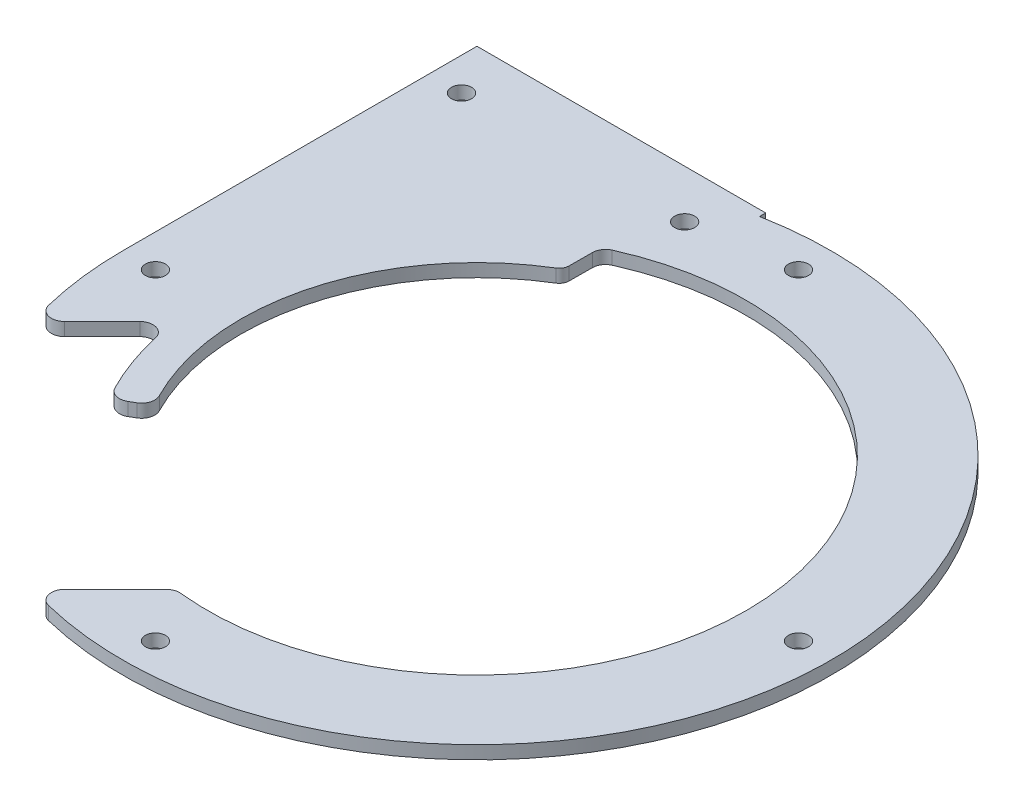
ISO-10303-21;
HEADER;
FILE_DESCRIPTION(('STEP AP214'),'2;1');
FILE_NAME('part.step','',(''),(''),'','','');
FILE_SCHEMA(('AUTOMOTIVE_DESIGN { 1 0 10303 214 1 1 1 1 }'));
ENDSEC;
DATA;
#1=APPLICATION_CONTEXT('core data for automotive mechanical design processes');
#2=APPLICATION_PROTOCOL_DEFINITION('international standard','automotive_design',2000,#1);
#3=PRODUCT_CONTEXT('',#1,'mechanical');
#4=PRODUCT('Part','Part','',(#3));
#5=PRODUCT_RELATED_PRODUCT_CATEGORY('part','',(#4));
#6=PRODUCT_DEFINITION_FORMATION('','',#4);
#7=PRODUCT_DEFINITION_CONTEXT('part definition',#1,'design');
#8=PRODUCT_DEFINITION('design','',#6,#7);
#9=PRODUCT_DEFINITION_SHAPE('','',#8);
#10=(LENGTH_UNIT() NAMED_UNIT(*) SI_UNIT(.MILLI.,.METRE.));
#11=(NAMED_UNIT(*) PLANE_ANGLE_UNIT() SI_UNIT($,.RADIAN.));
#12=(NAMED_UNIT(*) SI_UNIT($,.STERADIAN.) SOLID_ANGLE_UNIT());
#13=UNCERTAINTY_MEASURE_WITH_UNIT(LENGTH_MEASURE(1.E-05),#10,'distance_accuracy_value','');
#14=(GEOMETRIC_REPRESENTATION_CONTEXT(3) GLOBAL_UNCERTAINTY_ASSIGNED_CONTEXT((#13)) GLOBAL_UNIT_ASSIGNED_CONTEXT((#10,
#11,#12)) REPRESENTATION_CONTEXT('',''));
#15=CARTESIAN_POINT('',(0.,0.,0.));
#16=DIRECTION('',(0.,0.,1.));
#17=DIRECTION('',(1.,0.,0.));
#18=AXIS2_PLACEMENT_3D('',#15,#16,#17);
#19=CARTESIAN_POINT('',(0.,0.,0.));
#20=DIRECTION('',(0.,1.,0.));
#21=DIRECTION('',(0.,0.,1.));
#22=AXIS2_PLACEMENT_3D('',#19,#20,#21);
#23=PLANE('',#22);
#24=CARTESIAN_POINT('',(-49.,0.,-46.6476151587624));
#25=DIRECTION('',(0.,1.,0.));
#26=DIRECTION('',(0.,0.,1.));
#27=AXIS2_PLACEMENT_3D('',#24,#25,#26);
#28=CIRCLE('',#27,1.525);
#29=CARTESIAN_POINT('',(-49.,0.,-45.1226151587624));
#30=VERTEX_POINT('',#29);
#31=EDGE_CURVE('E194',#30,#30,#28,.T.);
#32=ORIENTED_EDGE('',*,*,#31,.T.);
#33=EDGE_LOOP('',(#32));
#34=FACE_BOUND('',#33,.T.);
#35=CARTESIAN_POINT('',(-49.,0.,0.));
#36=DIRECTION('',(0.,1.,0.));
#37=DIRECTION('',(0.,0.,1.));
#38=AXIS2_PLACEMENT_3D('',#35,#36,#37);
#39=CIRCLE('',#38,1.525);
#40=CARTESIAN_POINT('',(-49.,0.,1.525));
#41=VERTEX_POINT('',#40);
#42=EDGE_CURVE('E227',#41,#41,#39,.T.);
#43=ORIENTED_EDGE('',*,*,#42,.T.);
#44=EDGE_LOOP('',(#43));
#45=FACE_BOUND('',#44,.T.);
#46=CARTESIAN_POINT('',(0.,0.,49.));
#47=DIRECTION('',(0.,1.,0.));
#48=DIRECTION('',(0.,0.,1.));
#49=AXIS2_PLACEMENT_3D('',#46,#47,#48);
#50=CIRCLE('',#49,1.525);
#51=CARTESIAN_POINT('',(0.,0.,50.525));
#52=VERTEX_POINT('',#51);
#53=EDGE_CURVE('E232',#52,#52,#50,.T.);
#54=ORIENTED_EDGE('',*,*,#53,.T.);
#55=EDGE_LOOP('',(#54));
#56=FACE_BOUND('',#55,.T.);
#57=CARTESIAN_POINT('',(49.,0.,0.));
#58=DIRECTION('',(0.,1.,0.));
#59=DIRECTION('',(0.,0.,1.));
#60=AXIS2_PLACEMENT_3D('',#57,#58,#59);
#61=CIRCLE('',#60,1.525);
#62=CARTESIAN_POINT('',(49.,0.,1.52499999999999));
#63=VERTEX_POINT('',#62);
#64=EDGE_CURVE('E243',#63,#63,#61,.T.);
#65=ORIENTED_EDGE('',*,*,#64,.T.);
#66=EDGE_LOOP('',(#65));
#67=FACE_BOUND('',#66,.T.);
#68=CARTESIAN_POINT('',(0.,0.,-49.));
#69=DIRECTION('',(0.,1.,0.));
#70=DIRECTION('',(0.,0.,1.));
#71=AXIS2_PLACEMENT_3D('',#68,#69,#70);
#72=CIRCLE('',#71,1.525);
#73=CARTESIAN_POINT('',(0.,0.,-47.475));
#74=VERTEX_POINT('',#73);
#75=EDGE_CURVE('E252',#74,#74,#72,.T.);
#76=ORIENTED_EDGE('',*,*,#75,.T.);
#77=EDGE_LOOP('',(#76));
#78=FACE_BOUND('',#77,.T.);
#79=CARTESIAN_POINT('',(-15.,0.,-46.6476151587624));
#80=DIRECTION('',(0.,1.,0.));
#81=DIRECTION('',(0.,0.,1.));
#82=AXIS2_PLACEMENT_3D('',#79,#80,#81);
#83=CIRCLE('',#82,1.525);
#84=CARTESIAN_POINT('',(-15.,0.,-45.1226151587624));
#85=VERTEX_POINT('',#84);
#86=EDGE_CURVE('E259',#85,#85,#83,.T.);
#87=ORIENTED_EDGE('',*,*,#86,.T.);
#88=EDGE_LOOP('',(#87));
#89=FACE_BOUND('',#88,.T.);
#90=DIRECTION('',(-0.707106781186546,0.,0.707106781186549));
#91=VECTOR('',#90,1.);
#92=CARTESIAN_POINT('',(-16.1675664718771,0.,51.5229055312046));
#93=LINE('',#92,#91);
#94=CARTESIAN_POINT('',(-5.98664960273474,0.,41.3419886620622));
#95=VERTEX_POINT('',#94);
#96=CARTESIAN_POINT('',(-13.7468431952776,0.,49.102182254605));
#97=VERTEX_POINT('',#96);
#98=EDGE_CURVE('E436',#95,#97,#93,.T.);
#99=ORIENTED_EDGE('',*,*,#98,.F.);
#100=CARTESIAN_POINT('',(-4.57243604036164,0.,42.7562022244353));
#101=DIRECTION('',(0.,1.,0.));
#102=DIRECTION('',(0.,0.,1.));
#103=AXIS2_PLACEMENT_3D('',#100,#101,#102);
#104=CIRCLE('',#103,2.);
#105=CARTESIAN_POINT('',(-4.35976459662389,0.,40.7675416558569));
#106=VERTEX_POINT('',#105);
#107=EDGE_CURVE('E360',#95,#106,#104,.F.);
#108=ORIENTED_EDGE('',*,*,#107,.T.);
#109=CARTESIAN_POINT('',(0.,0.,0.));
#110=DIRECTION('',(0.,1.,0.));
#111=DIRECTION('',(0.,0.,1.));
#112=AXIS2_PLACEMENT_3D('',#109,#110,#111);
#113=CIRCLE('',#112,41.);
#114=CARTESIAN_POINT('',(-16.7986572287805,0.,-37.4006031409915));
#115=VERTEX_POINT('',#114);
#116=EDGE_CURVE('E266',#106,#115,#113,.T.);
#117=ORIENTED_EDGE('',*,*,#116,.T.);
#118=CARTESIAN_POINT('',(-15.9792105346936,0.,-35.5761834755773));
#119=DIRECTION('',(0.,1.,0.));
#120=DIRECTION('',(0.,0.,1.));
#121=AXIS2_PLACEMENT_3D('',#118,#119,#120);
#122=CIRCLE('',#121,2.);
#123=CARTESIAN_POINT('',(-17.9791882510179,0.,-35.5856245669424));
#124=VERTEX_POINT('',#123);
#125=EDGE_CURVE('E327',#115,#124,#122,.T.);
#126=ORIENTED_EDGE('',*,*,#125,.T.);
#127=DIRECTION('',(0.00472054568255677,0.,-0.999988858162159));
#128=VECTOR('',#127,1.);
#129=CARTESIAN_POINT('',(-17.9959889497554,0.,-32.0266056152006));
#130=LINE('',#129,#128);
#131=CARTESIAN_POINT('',(-17.9959889497554,0.,-32.0266056152006));
#132=VERTEX_POINT('',#131);
#133=EDGE_CURVE('E202',#132,#124,#130,.T.);
#134=ORIENTED_EDGE('',*,*,#133,.F.);
#135=CARTESIAN_POINT('',(-19.4959722369986,0.,-32.0336864337244));
#136=DIRECTION('',(0.,1.,0.));
#137=DIRECTION('',(0.,0.,1.));
#138=AXIS2_PLACEMENT_3D('',#135,#136,#137);
#139=CIRCLE('',#138,1.5);
#140=CARTESIAN_POINT('',(-18.7161333475187,0.,-30.7523389763754));
#141=VERTEX_POINT('',#140);
#142=EDGE_CURVE('E205',#141,#132,#139,.T.);
#143=ORIENTED_EDGE('',*,*,#142,.F.);
#144=CARTESIAN_POINT('',(0.,0.,0.));
#145=DIRECTION('',(0.,-1.,0.));
#146=DIRECTION('',(0.,0.,1.));
#147=AXIS2_PLACEMENT_3D('',#144,#145,#146);
#148=CIRCLE('',#147,36.);
#149=CARTESIAN_POINT('',(-32.0810716897673,0.,16.3341617243129));
#150=VERTEX_POINT('',#149);
#151=EDGE_CURVE('E212',#150,#141,#148,.T.);
#152=ORIENTED_EDGE('',*,*,#151,.F.);
#153=CARTESIAN_POINT('',(-33.86335345031,0.,17.2416151534414));
#154=DIRECTION('',(0.,1.,0.));
#155=DIRECTION('',(0.,0.,1.));
#156=AXIS2_PLACEMENT_3D('',#153,#154,#155);
#157=CIRCLE('',#156,2.);
#158=CARTESIAN_POINT('',(-32.86335345031,0.,18.9736659610103));
#159=VERTEX_POINT('',#158);
#160=EDGE_CURVE('E350',#150,#159,#157,.F.);
#161=ORIENTED_EDGE('',*,*,#160,.T.);
#162=DIRECTION('',(-0.866025403784438,0.,0.5));
#163=VECTOR('',#162,1.);
#164=CARTESIAN_POINT('',(-31.1769145362398,0.,18.));
#165=LINE('',#164,#163);
#166=CARTESIAN_POINT('',(-33.7305499510459,0.,19.4743420941505));
#167=VERTEX_POINT('',#166);
#168=EDGE_CURVE('E434',#159,#167,#165,.T.);
#169=ORIENTED_EDGE('',*,*,#168,.T.);
#170=CARTESIAN_POINT('',(-34.7305499510459,0.,17.7422912865816));
#171=DIRECTION('',(0.,1.,0.));
#172=DIRECTION('',(0.,0.,1.));
#173=AXIS2_PLACEMENT_3D('',#170,#171,#172);
#174=CIRCLE('',#173,2.);
#175=CARTESIAN_POINT('',(-36.5116037946892,0.,18.6521523782012));
#176=VERTEX_POINT('',#175);
#177=EDGE_CURVE('E358',#167,#176,#174,.F.);
#178=ORIENTED_EDGE('',*,*,#177,.T.);
#179=CARTESIAN_POINT('',(0.,0.,0.));
#180=DIRECTION('',(0.,1.,0.));
#181=DIRECTION('',(0.,0.,1.));
#182=AXIS2_PLACEMENT_3D('',#179,#180,#181);
#183=CIRCLE('',#182,41.);
#184=CARTESIAN_POINT('',(-40.0025759560338,0.,8.98854364631698));
#185=VERTEX_POINT('',#184);
#186=EDGE_CURVE('E416',#185,#176,#183,.T.);
#187=ORIENTED_EDGE('',*,*,#186,.F.);
#188=CARTESIAN_POINT('',(-41.9539211246208,0.,9.42700919003975));
#189=DIRECTION('',(0.,1.,0.));
#190=DIRECTION('',(0.,0.,1.));
#191=AXIS2_PLACEMENT_3D('',#188,#189,#190);
#192=CIRCLE('',#191,2.);
#193=CARTESIAN_POINT('',(-43.3681346869939,0.,8.01279562766666));
#194=VERTEX_POINT('',#193);
#195=EDGE_CURVE('E53',#185,#194,#192,.T.);
#196=ORIENTED_EDGE('',*,*,#195,.T.);
#197=DIRECTION('',(0.707106781186547,0.,-0.707106781186548));
#198=VECTOR('',#197,1.);
#199=CARTESIAN_POINT('',(-51.5229055312045,0.,16.1675664718773));
#200=LINE('',#199,#198);
#201=CARTESIAN_POINT('',(-49.102182254605,0.,13.7468431952777));
#202=VERTEX_POINT('',#201);
#203=EDGE_CURVE('E411',#202,#194,#200,.T.);
#204=ORIENTED_EDGE('',*,*,#203,.F.);
#205=CARTESIAN_POINT('',(-50.5163958169781,0.,12.3326296329046));
#206=DIRECTION('',(0.,1.,0.));
#207=DIRECTION('',(0.,0.,1.));
#208=AXIS2_PLACEMENT_3D('',#205,#206,#207);
#209=CIRCLE('',#208,2.);
#210=CARTESIAN_POINT('',(-52.4593341176311,0.,12.8069615418625));
#211=VERTEX_POINT('',#210);
#212=EDGE_CURVE('E355',#202,#211,#209,.F.);
#213=ORIENTED_EDGE('',*,*,#212,.T.);
#214=CARTESIAN_POINT('',(0.,0.,0.));
#215=DIRECTION('',(0.,1.,0.));
#216=DIRECTION('',(0.,0.,1.));
#217=AXIS2_PLACEMENT_3D('',#214,#215,#216);
#218=CIRCLE('',#217,54.);
#219=CARTESIAN_POINT('',(-54.,0.,0.));
#220=VERTEX_POINT('',#219);
#221=EDGE_CURVE('E292',#220,#211,#218,.T.);
#222=ORIENTED_EDGE('',*,*,#221,.F.);
#223=DIRECTION('',(0.,0.,1.));
#224=VECTOR('',#223,1.);
#225=CARTESIAN_POINT('',(-54.,0.,0.));
#226=LINE('',#225,#224);
#227=CARTESIAN_POINT('',(-54.,0.,-54.));
#228=VERTEX_POINT('',#227);
#229=EDGE_CURVE('E305',#228,#220,#226,.T.);
#230=ORIENTED_EDGE('',*,*,#229,.F.);
#231=DIRECTION('',(-1.,0.,0.));
#232=VECTOR('',#231,1.);
#233=CARTESIAN_POINT('',(-54.,0.,-54.));
#234=LINE('',#233,#232);
#235=CARTESIAN_POINT('',(-10.,0.,-54.));
#236=VERTEX_POINT('',#235);
#237=EDGE_CURVE('E299',#236,#228,#234,.T.);
#238=ORIENTED_EDGE('',*,*,#237,.F.);
#239=DIRECTION('',(0.,0.,-1.));
#240=VECTOR('',#239,1.);
#241=CARTESIAN_POINT('',(-10.,0.,-54.));
#242=LINE('',#241,#240);
#243=CARTESIAN_POINT('',(-10.,0.,-53.0659966456864));
#244=VERTEX_POINT('',#243);
#245=EDGE_CURVE('E298',#244,#236,#242,.T.);
#246=ORIENTED_EDGE('',*,*,#245,.F.);
#247=CARTESIAN_POINT('',(-12.8069615418623,0.,52.4593341176311));
#248=VERTEX_POINT('',#247);
#249=EDGE_CURVE('E274',#248,#244,#218,.T.);
#250=ORIENTED_EDGE('',*,*,#249,.F.);
#251=CARTESIAN_POINT('',(-12.3326296329045,0.,50.5163958169781));
#252=DIRECTION('',(0.,1.,0.));
#253=DIRECTION('',(0.,0.,1.));
#254=AXIS2_PLACEMENT_3D('',#251,#252,#253);
#255=CIRCLE('',#254,2.);
#256=EDGE_CURVE('E346',#248,#97,#255,.F.);
#257=ORIENTED_EDGE('',*,*,#256,.T.);
#258=EDGE_LOOP('',(#99,#108,#117,#126,#134,#143,#152,#161,#169,#178,#187,#196,#204,#213,#222,
#230,#238,#246,#250,#257));
#259=FACE_BOUND('',#258,.T.);
#260=ADVANCED_FACE('F44',(#34,#45,#56,#67,#78,#89,#259),#23,.F.);
#261=CARTESIAN_POINT('',(0.,2.,0.));
#262=DIRECTION('',(0.,-1.,0.));
#263=DIRECTION('',(0.,0.,-1.));
#264=AXIS2_PLACEMENT_3D('',#261,#262,#263);
#265=CYLINDRICAL_SURFACE('',#264,54.);
#266=ORIENTED_EDGE('',*,*,#221,.T.);
#267=DIRECTION('',(0.,-1.,0.));
#268=VECTOR('',#267,1.);
#269=CARTESIAN_POINT('',(-52.4593341176311,2.,12.8069615418625));
#270=LINE('',#269,#268);
#271=CARTESIAN_POINT('',(-52.4593341176311,2.,12.8069615418625));
#272=VERTEX_POINT('',#271);
#273=EDGE_CURVE('E398',#211,#272,#270,.F.);
#274=ORIENTED_EDGE('',*,*,#273,.T.);
#275=CARTESIAN_POINT('',(0.,2.,0.));
#276=DIRECTION('',(0.,1.,0.));
#277=DIRECTION('',(0.,0.,1.));
#278=AXIS2_PLACEMENT_3D('',#275,#276,#277);
#279=CIRCLE('',#278,54.);
#280=CARTESIAN_POINT('',(-54.,2.,0.));
#281=VERTEX_POINT('',#280);
#282=EDGE_CURVE('E280',#281,#272,#279,.T.);
#283=ORIENTED_EDGE('',*,*,#282,.F.);
#284=DIRECTION('',(0.,-1.,0.));
#285=VECTOR('',#284,1.);
#286=CARTESIAN_POINT('',(-54.,2.,0.));
#287=LINE('',#286,#285);
#288=EDGE_CURVE('E293',#281,#220,#287,.T.);
#289=ORIENTED_EDGE('',*,*,#288,.T.);
#290=EDGE_LOOP('',(#266,#274,#283,#289));
#291=FACE_BOUND('',#290,.T.);
#292=ADVANCED_FACE('F500',(#291),#265,.T.);
#293=CARTESIAN_POINT('',(0.,2.,0.));
#294=DIRECTION('',(0.,-1.,0.));
#295=DIRECTION('',(0.,0.,-1.));
#296=AXIS2_PLACEMENT_3D('',#293,#294,#295);
#297=CYLINDRICAL_SURFACE('',#296,41.);
#298=ORIENTED_EDGE('',*,*,#116,.F.);
#299=DIRECTION('',(0.,-1.,0.));
#300=VECTOR('',#299,1.);
#301=CARTESIAN_POINT('',(-4.35976459662389,2.,40.7675416558569));
#302=LINE('',#301,#300);
#303=CARTESIAN_POINT('',(-4.35976459662389,2.,40.7675416558569));
#304=VERTEX_POINT('',#303);
#305=EDGE_CURVE('E365',#106,#304,#302,.F.);
#306=ORIENTED_EDGE('',*,*,#305,.T.);
#307=CARTESIAN_POINT('',(0.,2.,0.));
#308=DIRECTION('',(0.,1.,0.));
#309=DIRECTION('',(0.,0.,1.));
#310=AXIS2_PLACEMENT_3D('',#307,#308,#309);
#311=CIRCLE('',#310,41.);
#312=CARTESIAN_POINT('',(-16.7986572287805,2.,-37.4006031409915));
#313=VERTEX_POINT('',#312);
#314=EDGE_CURVE('E272',#304,#313,#311,.T.);
#315=ORIENTED_EDGE('',*,*,#314,.T.);
#316=DIRECTION('',(0.,-1.,0.));
#317=VECTOR('',#316,1.);
#318=CARTESIAN_POINT('',(-16.7986572287805,2.,-37.4006031409915));
#319=LINE('',#318,#317);
#320=EDGE_CURVE('E318',#313,#115,#319,.T.);
#321=ORIENTED_EDGE('',*,*,#320,.T.);
#322=EDGE_LOOP('',(#298,#306,#315,#321));
#323=FACE_BOUND('',#322,.T.);
#324=ADVANCED_FACE('F518',(#323),#297,.F.);
#325=CARTESIAN_POINT('',(0.,2.,0.));
#326=DIRECTION('',(0.,1.,0.));
#327=DIRECTION('',(0.,0.,1.));
#328=AXIS2_PLACEMENT_3D('',#325,#326,#327);
#329=PLANE('',#328);
#330=ORIENTED_EDGE('',*,*,#314,.F.);
#331=CARTESIAN_POINT('',(-4.57243604036164,2.,42.7562022244353));
#332=DIRECTION('',(0.,1.,0.));
#333=DIRECTION('',(0.,0.,1.));
#334=AXIS2_PLACEMENT_3D('',#331,#332,#333);
#335=CIRCLE('',#334,2.);
#336=CARTESIAN_POINT('',(-5.98664960273474,2.,41.3419886620622));
#337=VERTEX_POINT('',#336);
#338=EDGE_CURVE('E374',#304,#337,#335,.T.);
#339=ORIENTED_EDGE('',*,*,#338,.T.);
#340=DIRECTION('',(0.707106781186546,0.,-0.707106781186549));
#341=VECTOR('',#340,1.);
#342=CARTESIAN_POINT('',(17.6776695296637,2.,17.6776695296636));
#343=LINE('',#342,#341);
#344=CARTESIAN_POINT('',(-13.7468431952776,2.,49.102182254605));
#345=VERTEX_POINT('',#344);
#346=EDGE_CURVE('E337',#345,#337,#343,.T.);
#347=ORIENTED_EDGE('',*,*,#346,.F.);
#348=CARTESIAN_POINT('',(-12.3326296329045,2.,50.5163958169781));
#349=DIRECTION('',(0.,1.,0.));
#350=DIRECTION('',(0.,0.,1.));
#351=AXIS2_PLACEMENT_3D('',#348,#349,#350);
#352=CIRCLE('',#351,2.);
#353=CARTESIAN_POINT('',(-12.8069615418623,2.,52.4593341176311));
#354=VERTEX_POINT('',#353);
#355=EDGE_CURVE('E370',#345,#354,#352,.T.);
#356=ORIENTED_EDGE('',*,*,#355,.T.);
#357=CARTESIAN_POINT('',(-10.,2.,-53.0659966456864));
#358=VERTEX_POINT('',#357);
#359=EDGE_CURVE('E285',#354,#358,#279,.T.);
#360=ORIENTED_EDGE('',*,*,#359,.T.);
#361=DIRECTION('',(0.,0.,-1.));
#362=VECTOR('',#361,1.);
#363=CARTESIAN_POINT('',(-10.,2.,-54.));
#364=LINE('',#363,#362);
#365=CARTESIAN_POINT('',(-10.,2.,-54.));
#366=VERTEX_POINT('',#365);
#367=EDGE_CURVE('E282',#358,#366,#364,.T.);
#368=ORIENTED_EDGE('',*,*,#367,.T.);
#369=DIRECTION('',(-1.,0.,0.));
#370=VECTOR('',#369,1.);
#371=CARTESIAN_POINT('',(-54.,2.,-54.));
#372=LINE('',#371,#370);
#373=CARTESIAN_POINT('',(-54.,2.,-54.));
#374=VERTEX_POINT('',#373);
#375=EDGE_CURVE('E281',#366,#374,#372,.T.);
#376=ORIENTED_EDGE('',*,*,#375,.T.);
#377=DIRECTION('',(0.,0.,1.));
#378=VECTOR('',#377,1.);
#379=CARTESIAN_POINT('',(-54.,2.,0.));
#380=LINE('',#379,#378);
#381=EDGE_CURVE('E290',#374,#281,#380,.T.);
#382=ORIENTED_EDGE('',*,*,#381,.T.);
#383=ORIENTED_EDGE('',*,*,#282,.T.);
#384=CARTESIAN_POINT('',(-50.5163958169781,2.,12.3326296329046));
#385=DIRECTION('',(0.,1.,0.));
#386=DIRECTION('',(0.,0.,1.));
#387=AXIS2_PLACEMENT_3D('',#384,#385,#386);
#388=CIRCLE('',#387,2.);
#389=CARTESIAN_POINT('',(-49.102182254605,2.,13.7468431952777));
#390=VERTEX_POINT('',#389);
#391=EDGE_CURVE('E369',#272,#390,#388,.T.);
#392=ORIENTED_EDGE('',*,*,#391,.T.);
#393=DIRECTION('',(-0.707106781186547,0.,0.707106781186548));
#394=VECTOR('',#393,1.);
#395=CARTESIAN_POINT('',(-17.6776695296637,2.,-17.6776695296636));
#396=LINE('',#395,#394);
#397=CARTESIAN_POINT('',(-43.3681346869939,2.,8.01279562766666));
#398=VERTEX_POINT('',#397);
#399=EDGE_CURVE('E331',#398,#390,#396,.T.);
#400=ORIENTED_EDGE('',*,*,#399,.F.);
#401=CARTESIAN_POINT('',(-41.9539211246208,2.,9.42700919003975));
#402=DIRECTION('',(0.,1.,0.));
#403=DIRECTION('',(0.,0.,1.));
#404=AXIS2_PLACEMENT_3D('',#401,#402,#403);
#405=CIRCLE('',#404,2.);
#406=CARTESIAN_POINT('',(-40.0025759560338,2.,8.98854364631698));
#407=VERTEX_POINT('',#406);
#408=EDGE_CURVE('E11',#398,#407,#405,.F.);
#409=ORIENTED_EDGE('',*,*,#408,.T.);
#410=CARTESIAN_POINT('',(0.,2.,0.));
#411=DIRECTION('',(0.,1.,0.));
#412=DIRECTION('',(0.,0.,1.));
#413=AXIS2_PLACEMENT_3D('',#410,#411,#412);
#414=CIRCLE('',#413,41.);
#415=CARTESIAN_POINT('',(-36.5116037946892,2.,18.6521523782012));
#416=VERTEX_POINT('',#415);
#417=EDGE_CURVE('E427',#416,#407,#414,.F.);
#418=ORIENTED_EDGE('',*,*,#417,.F.);
#419=CARTESIAN_POINT('',(-34.7305499510459,2.,17.7422912865816));
#420=DIRECTION('',(0.,1.,0.));
#421=DIRECTION('',(0.,0.,1.));
#422=AXIS2_PLACEMENT_3D('',#419,#420,#421);
#423=CIRCLE('',#422,2.);
#424=CARTESIAN_POINT('',(-33.7305499510459,2.,19.4743420941505));
#425=VERTEX_POINT('',#424);
#426=EDGE_CURVE('E70',#416,#425,#423,.T.);
#427=ORIENTED_EDGE('',*,*,#426,.T.);
#428=DIRECTION('',(-0.866025403784438,0.,0.5));
#429=VECTOR('',#428,1.);
#430=CARTESIAN_POINT('',(-31.1769145362398,2.,18.));
#431=LINE('',#430,#429);
#432=CARTESIAN_POINT('',(-32.86335345031,2.,18.9736659610103));
#433=VERTEX_POINT('',#432);
#434=EDGE_CURVE('E221',#433,#425,#431,.T.);
#435=ORIENTED_EDGE('',*,*,#434,.F.);
#436=CARTESIAN_POINT('',(-33.86335345031,2.,17.2416151534414));
#437=DIRECTION('',(0.,1.,0.));
#438=DIRECTION('',(0.,0.,1.));
#439=AXIS2_PLACEMENT_3D('',#436,#437,#438);
#440=CIRCLE('',#439,2.);
#441=CARTESIAN_POINT('',(-32.0810716897673,2.,16.3341617243129));
#442=VERTEX_POINT('',#441);
#443=EDGE_CURVE('E63',#433,#442,#440,.T.);
#444=ORIENTED_EDGE('',*,*,#443,.T.);
#445=CARTESIAN_POINT('',(0.,2.,0.));
#446=DIRECTION('',(0.,1.,0.));
#447=DIRECTION('',(0.,0.,1.));
#448=AXIS2_PLACEMENT_3D('',#445,#446,#447);
#449=CIRCLE('',#448,36.);
#450=CARTESIAN_POINT('',(-18.7161333475187,2.,-30.7523389763754));
#451=VERTEX_POINT('',#450);
#452=EDGE_CURVE('E208',#442,#451,#449,.F.);
#453=ORIENTED_EDGE('',*,*,#452,.T.);
#454=CARTESIAN_POINT('',(-19.4959722369986,2.,-32.0336864337244));
#455=DIRECTION('',(0.,1.,0.));
#456=DIRECTION('',(0.,0.,1.));
#457=AXIS2_PLACEMENT_3D('',#454,#455,#456);
#458=CIRCLE('',#457,1.5);
#459=CARTESIAN_POINT('',(-17.9959889497554,2.,-32.0266056152006));
#460=VERTEX_POINT('',#459);
#461=EDGE_CURVE('E192',#451,#460,#458,.T.);
#462=ORIENTED_EDGE('',*,*,#461,.T.);
#463=DIRECTION('',(0.00472054568255677,0.,-0.999988858162159));
#464=VECTOR('',#463,1.);
#465=CARTESIAN_POINT('',(-17.9959889497554,2.,-32.0266056152006));
#466=LINE('',#465,#464);
#467=CARTESIAN_POINT('',(-17.9791882510179,2.,-35.5856245669424));
#468=VERTEX_POINT('',#467);
#469=EDGE_CURVE('E185',#460,#468,#466,.T.);
#470=ORIENTED_EDGE('',*,*,#469,.T.);
#471=CARTESIAN_POINT('',(-15.9792105346936,2.,-35.5761834755773));
#472=DIRECTION('',(0.,1.,0.));
#473=DIRECTION('',(0.,0.,1.));
#474=AXIS2_PLACEMENT_3D('',#471,#472,#473);
#475=CIRCLE('',#474,2.);
#476=EDGE_CURVE('E329',#468,#313,#475,.F.);
#477=ORIENTED_EDGE('',*,*,#476,.T.);
#478=EDGE_LOOP('',(#330,#339,#347,#356,#360,#368,#376,#382,#383,#392,#400,#409,#418,#427,#435,
#444,#453,#462,#470,#477));
#479=FACE_BOUND('',#478,.T.);
#480=CARTESIAN_POINT('',(-49.,2.,0.));
#481=DIRECTION('',(0.,1.,0.));
#482=DIRECTION('',(0.,0.,1.));
#483=AXIS2_PLACEMENT_3D('',#480,#481,#482);
#484=CIRCLE('',#483,1.525);
#485=CARTESIAN_POINT('',(-49.,2.,1.525));
#486=VERTEX_POINT('',#485);
#487=EDGE_CURVE('E233',#486,#486,#484,.T.);
#488=ORIENTED_EDGE('',*,*,#487,.F.);
#489=EDGE_LOOP('',(#488));
#490=FACE_BOUND('',#489,.T.);
#491=CARTESIAN_POINT('',(49.,2.,0.));
#492=DIRECTION('',(0.,1.,0.));
#493=DIRECTION('',(0.,0.,1.));
#494=AXIS2_PLACEMENT_3D('',#491,#492,#493);
#495=CIRCLE('',#494,1.525);
#496=CARTESIAN_POINT('',(49.,2.,1.52499999999999));
#497=VERTEX_POINT('',#496);
#498=EDGE_CURVE('E250',#497,#497,#495,.T.);
#499=ORIENTED_EDGE('',*,*,#498,.F.);
#500=EDGE_LOOP('',(#499));
#501=FACE_BOUND('',#500,.T.);
#502=CARTESIAN_POINT('',(-15.,2.,-46.6476151587624));
#503=DIRECTION('',(0.,1.,0.));
#504=DIRECTION('',(0.,0.,1.));
#505=AXIS2_PLACEMENT_3D('',#502,#503,#504);
#506=CIRCLE('',#505,1.525);
#507=CARTESIAN_POINT('',(-15.,2.,-45.1226151587624));
#508=VERTEX_POINT('',#507);
#509=EDGE_CURVE('E263',#508,#508,#506,.T.);
#510=ORIENTED_EDGE('',*,*,#509,.F.);
#511=EDGE_LOOP('',(#510));
#512=FACE_BOUND('',#511,.T.);
#513=CARTESIAN_POINT('',(0.,2.,-49.));
#514=DIRECTION('',(0.,1.,0.));
#515=DIRECTION('',(0.,0.,1.));
#516=AXIS2_PLACEMENT_3D('',#513,#514,#515);
#517=CIRCLE('',#516,1.525);
#518=CARTESIAN_POINT('',(0.,2.,-47.475));
#519=VERTEX_POINT('',#518);
#520=EDGE_CURVE('E253',#519,#519,#517,.T.);
#521=ORIENTED_EDGE('',*,*,#520,.F.);
#522=EDGE_LOOP('',(#521));
#523=FACE_BOUND('',#522,.T.);
#524=CARTESIAN_POINT('',(0.,2.,49.));
#525=DIRECTION('',(0.,1.,0.));
#526=DIRECTION('',(0.,0.,1.));
#527=AXIS2_PLACEMENT_3D('',#524,#525,#526);
#528=CIRCLE('',#527,1.525);
#529=CARTESIAN_POINT('',(0.,2.,50.525));
#530=VERTEX_POINT('',#529);
#531=EDGE_CURVE('E237',#530,#530,#528,.T.);
#532=ORIENTED_EDGE('',*,*,#531,.F.);
#533=EDGE_LOOP('',(#532));
#534=FACE_BOUND('',#533,.T.);
#535=CARTESIAN_POINT('',(-49.,2.,-46.6476151587624));
#536=DIRECTION('',(0.,1.,0.));
#537=DIRECTION('',(0.,0.,1.));
#538=AXIS2_PLACEMENT_3D('',#535,#536,#537);
#539=CIRCLE('',#538,1.525);
#540=CARTESIAN_POINT('',(-49.,2.,-45.1226151587624));
#541=VERTEX_POINT('',#540);
#542=EDGE_CURVE('E225',#541,#541,#539,.T.);
#543=ORIENTED_EDGE('',*,*,#542,.F.);
#544=EDGE_LOOP('',(#543));
#545=FACE_BOUND('',#544,.T.);
#546=ADVANCED_FACE('F206',(#479,#490,#501,#512,#523,#534,#545),#329,.T.);
#547=ORIENTED_EDGE('',*,*,#359,.F.);
#548=DIRECTION('',(0.,-1.,0.));
#549=VECTOR('',#548,1.);
#550=CARTESIAN_POINT('',(-12.8069615418623,2.,52.4593341176311));
#551=LINE('',#550,#549);
#552=EDGE_CURVE('E405',#354,#248,#551,.T.);
#553=ORIENTED_EDGE('',*,*,#552,.T.);
#554=ORIENTED_EDGE('',*,*,#249,.T.);
#555=DIRECTION('',(0.,-1.,0.));
#556=VECTOR('',#555,1.);
#557=CARTESIAN_POINT('',(-10.,2.,-53.0659966456864));
#558=LINE('',#557,#556);
#559=EDGE_CURVE('E317',#358,#244,#558,.T.);
#560=ORIENTED_EDGE('',*,*,#559,.F.);
#561=EDGE_LOOP('',(#547,#553,#554,#560));
#562=FACE_BOUND('',#561,.T.);
#563=ADVANCED_FACE('F472',(#562),#265,.T.);
#564=CARTESIAN_POINT('',(-10.,2.,-54.));
#565=DIRECTION('',(-1.,0.,0.));
#566=DIRECTION('',(0.,0.,1.));
#567=AXIS2_PLACEMENT_3D('',#564,#565,#566);
#568=PLANE('',#567);
#569=ORIENTED_EDGE('',*,*,#245,.T.);
#570=DIRECTION('',(0.,-1.,0.));
#571=VECTOR('',#570,1.);
#572=CARTESIAN_POINT('',(-10.,2.,-54.));
#573=LINE('',#572,#571);
#574=EDGE_CURVE('E315',#366,#236,#573,.T.);
#575=ORIENTED_EDGE('',*,*,#574,.F.);
#576=ORIENTED_EDGE('',*,*,#367,.F.);
#577=ORIENTED_EDGE('',*,*,#559,.T.);
#578=EDGE_LOOP('',(#569,#575,#576,#577));
#579=FACE_BOUND('',#578,.T.);
#580=ADVANCED_FACE('F481',(#579),#568,.F.);
#581=CARTESIAN_POINT('',(-54.,2.,-54.));
#582=DIRECTION('',(0.,0.,1.));
#583=DIRECTION('',(1.,0.,0.));
#584=AXIS2_PLACEMENT_3D('',#581,#582,#583);
#585=PLANE('',#584);
#586=ORIENTED_EDGE('',*,*,#237,.T.);
#587=DIRECTION('',(0.,-1.,0.));
#588=VECTOR('',#587,1.);
#589=CARTESIAN_POINT('',(-54.,2.,-54.));
#590=LINE('',#589,#588);
#591=EDGE_CURVE('E308',#374,#228,#590,.T.);
#592=ORIENTED_EDGE('',*,*,#591,.F.);
#593=ORIENTED_EDGE('',*,*,#375,.F.);
#594=ORIENTED_EDGE('',*,*,#574,.T.);
#595=EDGE_LOOP('',(#586,#592,#593,#594));
#596=FACE_BOUND('',#595,.T.);
#597=ADVANCED_FACE('F487',(#596),#585,.F.);
#598=CARTESIAN_POINT('',(-54.,2.,0.));
#599=DIRECTION('',(1.,0.,0.));
#600=DIRECTION('',(0.,0.,-1.));
#601=AXIS2_PLACEMENT_3D('',#598,#599,#600);
#602=PLANE('',#601);
#603=ORIENTED_EDGE('',*,*,#229,.T.);
#604=ORIENTED_EDGE('',*,*,#288,.F.);
#605=ORIENTED_EDGE('',*,*,#381,.F.);
#606=ORIENTED_EDGE('',*,*,#591,.T.);
#607=EDGE_LOOP('',(#603,#604,#605,#606));
#608=FACE_BOUND('',#607,.T.);
#609=ADVANCED_FACE('F491',(#608),#602,.F.);
#610=CARTESIAN_POINT('',(-15.,2.,-46.6476151587624));
#611=DIRECTION('',(0.,-1.,0.));
#612=DIRECTION('',(0.,0.,-1.));
#613=AXIS2_PLACEMENT_3D('',#610,#611,#612);
#614=CYLINDRICAL_SURFACE('',#613,1.525);
#615=ORIENTED_EDGE('',*,*,#509,.T.);
#616=EDGE_LOOP('',(#615));
#617=FACE_BOUND('',#616,.T.);
#618=ORIENTED_EDGE('',*,*,#86,.F.);
#619=EDGE_LOOP('',(#618));
#620=FACE_BOUND('',#619,.T.);
#621=ADVANCED_FACE('F524',(#617,#620),#614,.F.);
#622=CARTESIAN_POINT('',(0.,2.,-49.));
#623=DIRECTION('',(0.,-1.,0.));
#624=DIRECTION('',(0.,0.,-1.));
#625=AXIS2_PLACEMENT_3D('',#622,#623,#624);
#626=CYLINDRICAL_SURFACE('',#625,1.525);
#627=ORIENTED_EDGE('',*,*,#520,.T.);
#628=EDGE_LOOP('',(#627));
#629=FACE_BOUND('',#628,.T.);
#630=ORIENTED_EDGE('',*,*,#75,.F.);
#631=EDGE_LOOP('',(#630));
#632=FACE_BOUND('',#631,.T.);
#633=ADVANCED_FACE('F573',(#629,#632),#626,.F.);
#634=CARTESIAN_POINT('',(49.,2.,0.));
#635=DIRECTION('',(0.,-1.,0.));
#636=DIRECTION('',(0.,0.,-1.));
#637=AXIS2_PLACEMENT_3D('',#634,#635,#636);
#638=CYLINDRICAL_SURFACE('',#637,1.525);
#639=ORIENTED_EDGE('',*,*,#498,.T.);
#640=EDGE_LOOP('',(#639));
#641=FACE_BOUND('',#640,.T.);
#642=ORIENTED_EDGE('',*,*,#64,.F.);
#643=EDGE_LOOP('',(#642));
#644=FACE_BOUND('',#643,.T.);
#645=ADVANCED_FACE('F569',(#641,#644),#638,.F.);
#646=CARTESIAN_POINT('',(0.,2.,49.));
#647=DIRECTION('',(0.,-1.,0.));
#648=DIRECTION('',(0.,0.,-1.));
#649=AXIS2_PLACEMENT_3D('',#646,#647,#648);
#650=CYLINDRICAL_SURFACE('',#649,1.525);
#651=ORIENTED_EDGE('',*,*,#531,.T.);
#652=EDGE_LOOP('',(#651));
#653=FACE_BOUND('',#652,.T.);
#654=ORIENTED_EDGE('',*,*,#53,.F.);
#655=EDGE_LOOP('',(#654));
#656=FACE_BOUND('',#655,.T.);
#657=ADVANCED_FACE('F566',(#653,#656),#650,.F.);
#658=CARTESIAN_POINT('',(-49.,2.,0.));
#659=DIRECTION('',(0.,-1.,0.));
#660=DIRECTION('',(0.,0.,-1.));
#661=AXIS2_PLACEMENT_3D('',#658,#659,#660);
#662=CYLINDRICAL_SURFACE('',#661,1.525);
#663=ORIENTED_EDGE('',*,*,#487,.T.);
#664=EDGE_LOOP('',(#663));
#665=FACE_BOUND('',#664,.T.);
#666=ORIENTED_EDGE('',*,*,#42,.F.);
#667=EDGE_LOOP('',(#666));
#668=FACE_BOUND('',#667,.T.);
#669=ADVANCED_FACE('F565',(#665,#668),#662,.F.);
#670=CARTESIAN_POINT('',(-49.,2.,-46.6476151587624));
#671=DIRECTION('',(0.,-1.,0.));
#672=DIRECTION('',(0.,0.,-1.));
#673=AXIS2_PLACEMENT_3D('',#670,#671,#672);
#674=CYLINDRICAL_SURFACE('',#673,1.525);
#675=ORIENTED_EDGE('',*,*,#542,.T.);
#676=EDGE_LOOP('',(#675));
#677=FACE_BOUND('',#676,.T.);
#678=ORIENTED_EDGE('',*,*,#31,.F.);
#679=EDGE_LOOP('',(#678));
#680=FACE_BOUND('',#679,.T.);
#681=ADVANCED_FACE('F559',(#677,#680),#674,.F.);
#682=CARTESIAN_POINT('',(-19.4959722369986,45.4533796671224,-32.0336864337244));
#683=DIRECTION('',(0.,-1.,0.));
#684=DIRECTION('',(0.,0.,-1.));
#685=AXIS2_PLACEMENT_3D('',#682,#683,#684);
#686=CYLINDRICAL_SURFACE('',#685,1.5);
#687=ORIENTED_EDGE('',*,*,#461,.F.);
#688=DIRECTION('',(0.,-1.,0.));
#689=VECTOR('',#688,1.);
#690=CARTESIAN_POINT('',(-18.7161333475187,45.4533796671224,-30.7523389763754));
#691=LINE('',#690,#689);
#692=EDGE_CURVE('E219',#451,#141,#691,.T.);
#693=ORIENTED_EDGE('',*,*,#692,.T.);
#694=ORIENTED_EDGE('',*,*,#142,.T.);
#695=DIRECTION('',(0.,-1.,0.));
#696=VECTOR('',#695,1.);
#697=CARTESIAN_POINT('',(-17.9959889497554,45.4533796671224,-32.0266056152006));
#698=LINE('',#697,#696);
#699=EDGE_CURVE('E187',#460,#132,#698,.T.);
#700=ORIENTED_EDGE('',*,*,#699,.F.);
#701=EDGE_LOOP('',(#687,#693,#694,#700));
#702=FACE_BOUND('',#701,.T.);
#703=ADVANCED_FACE('F196',(#702),#686,.T.);
#704=CARTESIAN_POINT('',(-17.9959889497554,45.4533796671224,-32.0266056152006));
#705=DIRECTION('',(-0.999988858162159,0.,-0.00472054568255677));
#706=DIRECTION('',(-0.00472054568255677,0.,0.999988858162159));
#707=AXIS2_PLACEMENT_3D('',#704,#705,#706);
#708=PLANE('',#707);
#709=ORIENTED_EDGE('',*,*,#133,.T.);
#710=DIRECTION('',(0.,-1.,0.));
#711=VECTOR('',#710,1.);
#712=CARTESIAN_POINT('',(-17.9791882510179,45.4533796671224,-35.5856245669424));
#713=LINE('',#712,#711);
#714=EDGE_CURVE('E186',#124,#468,#713,.F.);
#715=ORIENTED_EDGE('',*,*,#714,.T.);
#716=ORIENTED_EDGE('',*,*,#469,.F.);
#717=ORIENTED_EDGE('',*,*,#699,.T.);
#718=EDGE_LOOP('',(#709,#715,#716,#717));
#719=FACE_BOUND('',#718,.T.);
#720=ADVANCED_FACE('F184',(#719),#708,.F.);
#721=CARTESIAN_POINT('',(0.,45.4533796671224,0.));
#722=DIRECTION('',(0.,-1.,0.));
#723=DIRECTION('',(0.,0.,-1.));
#724=AXIS2_PLACEMENT_3D('',#721,#722,#723);
#725=CYLINDRICAL_SURFACE('',#724,36.);
#726=ORIENTED_EDGE('',*,*,#452,.F.);
#727=DIRECTION('',(0.,-1.,0.));
#728=VECTOR('',#727,1.);
#729=CARTESIAN_POINT('',(-32.0810716897673,45.4533796671224,16.3341617243129));
#730=LINE('',#729,#728);
#731=EDGE_CURVE('E408',#442,#150,#730,.T.);
#732=ORIENTED_EDGE('',*,*,#731,.T.);
#733=ORIENTED_EDGE('',*,*,#151,.T.);
#734=ORIENTED_EDGE('',*,*,#692,.F.);
#735=EDGE_LOOP('',(#726,#732,#733,#734));
#736=FACE_BOUND('',#735,.T.);
#737=ADVANCED_FACE('F535',(#736),#725,.F.);
#738=CARTESIAN_POINT('',(-15.9792105346936,2.,-35.5761834755773));
#739=DIRECTION('',(0.,-1.,0.));
#740=DIRECTION('',(0.,0.,-1.));
#741=AXIS2_PLACEMENT_3D('',#738,#739,#740);
#742=CYLINDRICAL_SURFACE('',#741,2.);
#743=ORIENTED_EDGE('',*,*,#476,.F.);
#744=ORIENTED_EDGE('',*,*,#714,.F.);
#745=ORIENTED_EDGE('',*,*,#125,.F.);
#746=ORIENTED_EDGE('',*,*,#320,.F.);
#747=EDGE_LOOP('',(#743,#744,#745,#746));
#748=FACE_BOUND('',#747,.T.);
#749=ADVANCED_FACE('F454',(#748),#742,.F.);
#750=CARTESIAN_POINT('',(-31.1769145362398,2.,18.));
#751=DIRECTION('',(0.500000000000001,0.,0.866025403784438));
#752=DIRECTION('',(0.866025403784438,0.,-0.500000000000001));
#753=AXIS2_PLACEMENT_3D('',#750,#751,#752);
#754=PLANE('',#753);
#755=ORIENTED_EDGE('',*,*,#434,.T.);
#756=DIRECTION('',(0.,1.,0.));
#757=VECTOR('',#756,1.);
#758=CARTESIAN_POINT('',(-33.7305499510459,0.,19.4743420941505));
#759=LINE('',#758,#757);
#760=EDGE_CURVE('E382',#425,#167,#759,.F.);
#761=ORIENTED_EDGE('',*,*,#760,.T.);
#762=ORIENTED_EDGE('',*,*,#168,.F.);
#763=DIRECTION('',(0.,1.,0.));
#764=VECTOR('',#763,1.);
#765=CARTESIAN_POINT('',(-32.86335345031,2.,18.9736659610103));
#766=LINE('',#765,#764);
#767=EDGE_CURVE('E377',#159,#433,#766,.T.);
#768=ORIENTED_EDGE('',*,*,#767,.T.);
#769=EDGE_LOOP('',(#755,#761,#762,#768));
#770=FACE_BOUND('',#769,.T.);
#771=ADVANCED_FACE('F532',(#770),#754,.T.);
#772=CARTESIAN_POINT('',(-51.5229055312045,10.,16.1675664718773));
#773=DIRECTION('',(-0.707106781186548,0.,-0.707106781186547));
#774=DIRECTION('',(-0.707106781186547,0.,0.707106781186548));
#775=AXIS2_PLACEMENT_3D('',#772,#773,#774);
#776=PLANE('',#775);
#777=ORIENTED_EDGE('',*,*,#203,.T.);
#778=DIRECTION('',(0.,1.,0.));
#779=VECTOR('',#778,1.);
#780=CARTESIAN_POINT('',(-43.3681346869939,2.,8.01279562766666));
#781=LINE('',#780,#779);
#782=EDGE_CURVE('E399',#194,#398,#781,.T.);
#783=ORIENTED_EDGE('',*,*,#782,.T.);
#784=ORIENTED_EDGE('',*,*,#399,.T.);
#785=DIRECTION('',(0.,-1.,0.));
#786=VECTOR('',#785,1.);
#787=CARTESIAN_POINT('',(-49.102182254605,10.,13.7468431952777));
#788=LINE('',#787,#786);
#789=EDGE_CURVE('E395',#390,#202,#788,.T.);
#790=ORIENTED_EDGE('',*,*,#789,.T.);
#791=EDGE_LOOP('',(#777,#783,#784,#790));
#792=FACE_BOUND('',#791,.T.);
#793=ADVANCED_FACE('F422',(#792),#776,.F.);
#794=CARTESIAN_POINT('',(0.,10.,0.));
#795=DIRECTION('',(0.,-1.,0.));
#796=DIRECTION('',(0.,0.,-1.));
#797=AXIS2_PLACEMENT_3D('',#794,#795,#796);
#798=CYLINDRICAL_SURFACE('',#797,41.);
#799=ORIENTED_EDGE('',*,*,#186,.T.);
#800=DIRECTION('',(0.,-1.,0.));
#801=VECTOR('',#800,1.);
#802=CARTESIAN_POINT('',(-36.5116037946892,10.,18.6521523782012));
#803=LINE('',#802,#801);
#804=EDGE_CURVE('E389',#176,#416,#803,.F.);
#805=ORIENTED_EDGE('',*,*,#804,.T.);
#806=ORIENTED_EDGE('',*,*,#417,.T.);
#807=DIRECTION('',(0.,-1.,0.));
#808=VECTOR('',#807,1.);
#809=CARTESIAN_POINT('',(-40.0025759560338,10.,8.98854364631698));
#810=LINE('',#809,#808);
#811=EDGE_CURVE('E383',#407,#185,#810,.T.);
#812=ORIENTED_EDGE('',*,*,#811,.T.);
#813=EDGE_LOOP('',(#799,#805,#806,#812));
#814=FACE_BOUND('',#813,.T.);
#815=ADVANCED_FACE('F435',(#814),#798,.T.);
#816=CARTESIAN_POINT('',(-16.1675664718771,10.,51.5229055312046));
#817=DIRECTION('',(0.707106781186549,0.,0.707106781186546));
#818=DIRECTION('',(0.707106781186546,0.,-0.707106781186549));
#819=AXIS2_PLACEMENT_3D('',#816,#817,#818);
#820=PLANE('',#819);
#821=ORIENTED_EDGE('',*,*,#346,.T.);
#822=DIRECTION('',(0.,1.,0.));
#823=VECTOR('',#822,1.);
#824=CARTESIAN_POINT('',(-5.98664960273474,0.,41.3419886620622));
#825=LINE('',#824,#823);
#826=EDGE_CURVE('E341',#337,#95,#825,.F.);
#827=ORIENTED_EDGE('',*,*,#826,.T.);
#828=ORIENTED_EDGE('',*,*,#98,.T.);
#829=DIRECTION('',(0.,-1.,0.));
#830=VECTOR('',#829,1.);
#831=CARTESIAN_POINT('',(-13.7468431952776,10.,49.102182254605));
#832=LINE('',#831,#830);
#833=EDGE_CURVE('E338',#97,#345,#832,.F.);
#834=ORIENTED_EDGE('',*,*,#833,.T.);
#835=EDGE_LOOP('',(#821,#827,#828,#834));
#836=FACE_BOUND('',#835,.T.);
#837=ADVANCED_FACE('F463',(#836),#820,.F.);
#838=CARTESIAN_POINT('',(-4.57243604036164,2.,42.7562022244353));
#839=DIRECTION('',(0.,-1.,0.));
#840=DIRECTION('',(0.,0.,-1.));
#841=AXIS2_PLACEMENT_3D('',#838,#839,#840);
#842=CYLINDRICAL_SURFACE('',#841,2.);
#843=ORIENTED_EDGE('',*,*,#338,.F.);
#844=ORIENTED_EDGE('',*,*,#305,.F.);
#845=ORIENTED_EDGE('',*,*,#107,.F.);
#846=ORIENTED_EDGE('',*,*,#826,.F.);
#847=EDGE_LOOP('',(#843,#844,#845,#846));
#848=FACE_BOUND('',#847,.T.);
#849=ADVANCED_FACE('F461',(#848),#842,.T.);
#850=CARTESIAN_POINT('',(-34.7305499510459,10.,17.7422912865816));
#851=DIRECTION('',(0.,-1.,0.));
#852=DIRECTION('',(0.,0.,-1.));
#853=AXIS2_PLACEMENT_3D('',#850,#851,#852);
#854=CYLINDRICAL_SURFACE('',#853,2.);
#855=ORIENTED_EDGE('',*,*,#426,.F.);
#856=ORIENTED_EDGE('',*,*,#804,.F.);
#857=ORIENTED_EDGE('',*,*,#177,.F.);
#858=ORIENTED_EDGE('',*,*,#760,.F.);
#859=EDGE_LOOP('',(#855,#856,#857,#858));
#860=FACE_BOUND('',#859,.T.);
#861=ADVANCED_FACE('F510',(#860),#854,.T.);
#862=CARTESIAN_POINT('',(-41.9539211246208,10.,9.42700919003975));
#863=DIRECTION('',(0.,-1.,0.));
#864=DIRECTION('',(0.,0.,-1.));
#865=AXIS2_PLACEMENT_3D('',#862,#863,#864);
#866=CYLINDRICAL_SURFACE('',#865,2.);
#867=ORIENTED_EDGE('',*,*,#408,.F.);
#868=ORIENTED_EDGE('',*,*,#782,.F.);
#869=ORIENTED_EDGE('',*,*,#195,.F.);
#870=ORIENTED_EDGE('',*,*,#811,.F.);
#871=EDGE_LOOP('',(#867,#868,#869,#870));
#872=FACE_BOUND('',#871,.T.);
#873=ADVANCED_FACE('F426',(#872),#866,.F.);
#874=CARTESIAN_POINT('',(-50.5163958169781,2.,12.3326296329046));
#875=DIRECTION('',(0.,-1.,0.));
#876=DIRECTION('',(0.,0.,-1.));
#877=AXIS2_PLACEMENT_3D('',#874,#875,#876);
#878=CYLINDRICAL_SURFACE('',#877,2.);
#879=ORIENTED_EDGE('',*,*,#391,.F.);
#880=ORIENTED_EDGE('',*,*,#273,.F.);
#881=ORIENTED_EDGE('',*,*,#212,.F.);
#882=ORIENTED_EDGE('',*,*,#789,.F.);
#883=EDGE_LOOP('',(#879,#880,#881,#882));
#884=FACE_BOUND('',#883,.T.);
#885=ADVANCED_FACE('F499',(#884),#878,.T.);
#886=CARTESIAN_POINT('',(-12.3326296329045,2.,50.5163958169781));
#887=DIRECTION('',(0.,-1.,0.));
#888=DIRECTION('',(0.,0.,-1.));
#889=AXIS2_PLACEMENT_3D('',#886,#887,#888);
#890=CYLINDRICAL_SURFACE('',#889,2.);
#891=ORIENTED_EDGE('',*,*,#355,.F.);
#892=ORIENTED_EDGE('',*,*,#833,.F.);
#893=ORIENTED_EDGE('',*,*,#256,.F.);
#894=ORIENTED_EDGE('',*,*,#552,.F.);
#895=EDGE_LOOP('',(#891,#892,#893,#894));
#896=FACE_BOUND('',#895,.T.);
#897=ADVANCED_FACE('F475',(#896),#890,.T.);
#898=CARTESIAN_POINT('',(-33.86335345031,45.4533796671224,17.2416151534414));
#899=DIRECTION('',(0.,-1.,0.));
#900=DIRECTION('',(0.,0.,-1.));
#901=AXIS2_PLACEMENT_3D('',#898,#899,#900);
#902=CYLINDRICAL_SURFACE('',#901,2.);
#903=ORIENTED_EDGE('',*,*,#443,.F.);
#904=ORIENTED_EDGE('',*,*,#767,.F.);
#905=ORIENTED_EDGE('',*,*,#160,.F.);
#906=ORIENTED_EDGE('',*,*,#731,.F.);
#907=EDGE_LOOP('',(#903,#904,#905,#906));
#908=FACE_BOUND('',#907,.T.);
#909=ADVANCED_FACE('F50',(#908),#902,.T.);
#910=CLOSED_SHELL('',(#260,#292,#324,#546,#563,#580,#597,#609,#621,#633,#645,#657,#669,#681,
#703,#720,#737,#749,#771,#793,#815,#837,#849,#861,#873,#885,#897,#909));
#911=MANIFOLD_SOLID_BREP('B2',#910);
#912=ADVANCED_BREP_SHAPE_REPRESENTATION('',(#18,#911),#14);
#913=SHAPE_DEFINITION_REPRESENTATION(#9,#912);
ENDSEC;
END-ISO-10303-21;
